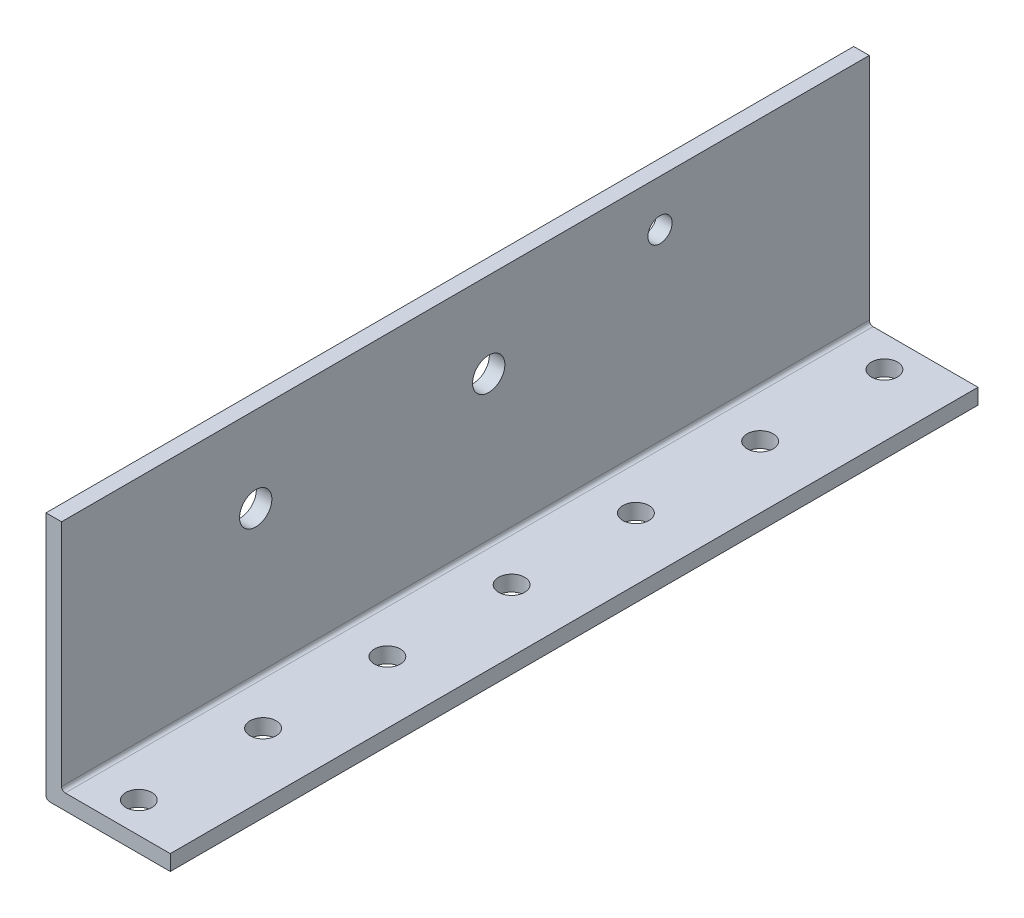
ISO-10303-21;
HEADER;
FILE_DESCRIPTION(('STEP AP214'),'2;1');
FILE_NAME('part.step','',(''),(''),'','','');
FILE_SCHEMA(('AUTOMOTIVE_DESIGN { 1 0 10303 214 1 1 1 1 }'));
ENDSEC;
DATA;
#1=APPLICATION_CONTEXT('core data for automotive mechanical design processes');
#2=APPLICATION_PROTOCOL_DEFINITION('international standard','automotive_design',2000,#1);
#3=PRODUCT_CONTEXT('',#1,'mechanical');
#4=PRODUCT('Part','Part','',(#3));
#5=PRODUCT_RELATED_PRODUCT_CATEGORY('part','',(#4));
#6=PRODUCT_DEFINITION_FORMATION('','',#4);
#7=PRODUCT_DEFINITION_CONTEXT('part definition',#1,'design');
#8=PRODUCT_DEFINITION('design','',#6,#7);
#9=PRODUCT_DEFINITION_SHAPE('','',#8);
#10=(LENGTH_UNIT() NAMED_UNIT(*) SI_UNIT(.MILLI.,.METRE.));
#11=(NAMED_UNIT(*) PLANE_ANGLE_UNIT() SI_UNIT($,.RADIAN.));
#12=(NAMED_UNIT(*) SI_UNIT($,.STERADIAN.) SOLID_ANGLE_UNIT());
#13=UNCERTAINTY_MEASURE_WITH_UNIT(LENGTH_MEASURE(1.E-05),#10,'distance_accuracy_value','');
#14=(GEOMETRIC_REPRESENTATION_CONTEXT(3) GLOBAL_UNCERTAINTY_ASSIGNED_CONTEXT((#13)) GLOBAL_UNIT_ASSIGNED_CONTEXT((#10,
#11,#12)) REPRESENTATION_CONTEXT('',''));
#15=CARTESIAN_POINT('',(0.,0.,0.));
#16=DIRECTION('',(0.,0.,1.));
#17=DIRECTION('',(1.,0.,0.));
#18=AXIS2_PLACEMENT_3D('',#15,#16,#17);
#19=CARTESIAN_POINT('',(0.,50.8,165.1));
#20=DIRECTION('',(0.,-1.,0.));
#21=DIRECTION('',(0.,0.,-1.));
#22=AXIS2_PLACEMENT_3D('',#19,#20,#21);
#23=PLANE('',#22);
#24=DIRECTION('',(-1.,0.,0.));
#25=VECTOR('',#24,1.);
#26=CARTESIAN_POINT('',(0.,50.8,0.));
#27=LINE('',#26,#25);
#28=CARTESIAN_POINT('',(3.17499999999999,50.8,0.));
#29=VERTEX_POINT('',#28);
#30=CARTESIAN_POINT('',(0.,50.8,0.));
#31=VERTEX_POINT('',#30);
#32=EDGE_CURVE('E130',#29,#31,#27,.T.);
#33=ORIENTED_EDGE('',*,*,#32,.T.);
#34=DIRECTION('',(0.,0.,-1.));
#35=VECTOR('',#34,1.);
#36=CARTESIAN_POINT('',(0.,50.8,165.1));
#37=LINE('',#36,#35);
#38=CARTESIAN_POINT('',(0.,50.8,165.1));
#39=VERTEX_POINT('',#38);
#40=EDGE_CURVE('E11',#39,#31,#37,.T.);
#41=ORIENTED_EDGE('',*,*,#40,.F.);
#42=DIRECTION('',(-1.,0.,0.));
#43=VECTOR('',#42,1.);
#44=CARTESIAN_POINT('',(0.,50.8,165.1));
#45=LINE('',#44,#43);
#46=CARTESIAN_POINT('',(3.17499999999999,50.8,165.1));
#47=VERTEX_POINT('',#46);
#48=EDGE_CURVE('E145',#47,#39,#45,.T.);
#49=ORIENTED_EDGE('',*,*,#48,.F.);
#50=DIRECTION('',(0.,0.,-1.));
#51=VECTOR('',#50,1.);
#52=CARTESIAN_POINT('',(3.17499999999999,50.8,165.1));
#53=LINE('',#52,#51);
#54=EDGE_CURVE('E126',#47,#29,#53,.T.);
#55=ORIENTED_EDGE('',*,*,#54,.T.);
#56=EDGE_LOOP('',(#33,#41,#49,#55));
#57=FACE_BOUND('',#56,.T.);
#58=ADVANCED_FACE('F33',(#57),#23,.F.);
#59=CARTESIAN_POINT('',(0.,0.762000000000005,165.1));
#60=DIRECTION('',(1.,0.,0.));
#61=DIRECTION('',(0.,0.,-1.));
#62=AXIS2_PLACEMENT_3D('',#59,#60,#61);
#63=PLANE('',#62);
#64=CARTESIAN_POINT('',(0.,41.347136,42.773092));
#65=DIRECTION('',(1.,0.,0.));
#66=DIRECTION('',(0.,0.,-1.));
#67=AXIS2_PLACEMENT_3D('',#64,#65,#66);
#68=CIRCLE('',#67,2.4765);
#69=CARTESIAN_POINT('',(0.,43.823636,42.773092));
#70=VERTEX_POINT('',#69);
#71=EDGE_CURVE('E232',#70,#70,#68,.F.);
#72=ORIENTED_EDGE('',*,*,#71,.F.);
#73=EDGE_LOOP('',(#72));
#74=FACE_BOUND('',#73,.T.);
#75=CARTESIAN_POINT('',(0.,33.3375,125.4125));
#76=DIRECTION('',(1.,0.,0.));
#77=DIRECTION('',(0.,0.,-1.));
#78=AXIS2_PLACEMENT_3D('',#75,#76,#77);
#79=CIRCLE('',#78,3.30199999999998);
#80=CARTESIAN_POINT('',(0.,33.3375,122.1105));
#81=VERTEX_POINT('',#80);
#82=EDGE_CURVE('E226',#81,#81,#79,.F.);
#83=ORIENTED_EDGE('',*,*,#82,.F.);
#84=EDGE_LOOP('',(#83));
#85=FACE_BOUND('',#84,.T.);
#86=CARTESIAN_POINT('',(0.,33.3375,77.7875));
#87=DIRECTION('',(1.,0.,0.));
#88=DIRECTION('',(0.,0.,-1.));
#89=AXIS2_PLACEMENT_3D('',#86,#87,#88);
#90=CIRCLE('',#89,3.30199999999998);
#91=CARTESIAN_POINT('',(0.,33.3375,74.4855));
#92=VERTEX_POINT('',#91);
#93=EDGE_CURVE('E192',#92,#92,#90,.F.);
#94=ORIENTED_EDGE('',*,*,#93,.F.);
#95=EDGE_LOOP('',(#94));
#96=FACE_BOUND('',#95,.T.);
#97=DIRECTION('',(0.,-1.,0.));
#98=VECTOR('',#97,1.);
#99=CARTESIAN_POINT('',(0.,0.762000000000005,0.));
#100=LINE('',#99,#98);
#101=CARTESIAN_POINT('',(0.,0.762000000000005,0.));
#102=VERTEX_POINT('',#101);
#103=EDGE_CURVE('E133',#31,#102,#100,.T.);
#104=ORIENTED_EDGE('',*,*,#103,.T.);
#105=DIRECTION('',(0.,0.,-1.));
#106=VECTOR('',#105,1.);
#107=CARTESIAN_POINT('',(0.,0.762000000000005,165.1));
#108=LINE('',#107,#106);
#109=CARTESIAN_POINT('',(0.,0.762000000000005,165.1));
#110=VERTEX_POINT('',#109);
#111=EDGE_CURVE('E42',#110,#102,#108,.T.);
#112=ORIENTED_EDGE('',*,*,#111,.F.);
#113=DIRECTION('',(0.,-1.,0.));
#114=VECTOR('',#113,1.);
#115=CARTESIAN_POINT('',(0.,0.762000000000005,165.1));
#116=LINE('',#115,#114);
#117=EDGE_CURVE('E93',#39,#110,#116,.T.);
#118=ORIENTED_EDGE('',*,*,#117,.F.);
#119=ORIENTED_EDGE('',*,*,#40,.T.);
#120=EDGE_LOOP('',(#104,#112,#118,#119));
#121=FACE_BOUND('',#120,.T.);
#122=ADVANCED_FACE('F253',(#74,#85,#96,#121),#63,.F.);
#123=CARTESIAN_POINT('',(0.762,0.762,165.1));
#124=DIRECTION('',(0.,0.,-1.));
#125=DIRECTION('',(-1.,0.,0.));
#126=AXIS2_PLACEMENT_3D('',#123,#124,#125);
#127=CYLINDRICAL_SURFACE('',#126,0.762);
#128=CARTESIAN_POINT('',(0.762,0.762,0.));
#129=DIRECTION('',(0.,0.,1.));
#130=DIRECTION('',(1.,0.,0.));
#131=AXIS2_PLACEMENT_3D('',#128,#129,#130);
#132=CIRCLE('',#131,0.762);
#133=CARTESIAN_POINT('',(0.762000000000005,0.,0.));
#134=VERTEX_POINT('',#133);
#135=EDGE_CURVE('E136',#102,#134,#132,.T.);
#136=ORIENTED_EDGE('',*,*,#135,.T.);
#137=DIRECTION('',(0.,0.,-1.));
#138=VECTOR('',#137,1.);
#139=CARTESIAN_POINT('',(0.762000000000005,0.,165.1));
#140=LINE('',#139,#138);
#141=CARTESIAN_POINT('',(0.762000000000005,0.,165.1));
#142=VERTEX_POINT('',#141);
#143=EDGE_CURVE('E152',#142,#134,#140,.T.);
#144=ORIENTED_EDGE('',*,*,#143,.F.);
#145=CARTESIAN_POINT('',(0.762,0.762,165.1));
#146=DIRECTION('',(0.,0.,1.));
#147=DIRECTION('',(1.,0.,0.));
#148=AXIS2_PLACEMENT_3D('',#145,#146,#147);
#149=CIRCLE('',#148,0.762);
#150=EDGE_CURVE('E161',#110,#142,#149,.T.);
#151=ORIENTED_EDGE('',*,*,#150,.F.);
#152=ORIENTED_EDGE('',*,*,#111,.T.);
#153=EDGE_LOOP('',(#136,#144,#151,#152));
#154=FACE_BOUND('',#153,.T.);
#155=ADVANCED_FACE('F159',(#154),#127,.T.);
#156=CARTESIAN_POINT('',(0.762000000000005,0.,165.1));
#157=DIRECTION('',(0.,1.,0.));
#158=DIRECTION('',(0.,0.,1.));
#159=AXIS2_PLACEMENT_3D('',#156,#157,#158);
#160=PLANE('',#159);
#161=CARTESIAN_POINT('',(12.6999999999999,0.,31.82874));
#162=DIRECTION('',(0.,-1.,0.));
#163=DIRECTION('',(0.,0.,-1.));
#164=AXIS2_PLACEMENT_3D('',#161,#162,#163);
#165=CIRCLE('',#164,2.667);
#166=CARTESIAN_POINT('',(12.6999999999999,0.,29.16174));
#167=VERTEX_POINT('',#166);
#168=EDGE_CURVE('E214',#167,#167,#165,.T.);
#169=ORIENTED_EDGE('',*,*,#168,.F.);
#170=EDGE_LOOP('',(#169));
#171=FACE_BOUND('',#170,.T.);
#172=CARTESIAN_POINT('',(12.6999999999998,0.,57.22874));
#173=DIRECTION('',(0.,-1.,0.));
#174=DIRECTION('',(0.,0.,-1.));
#175=AXIS2_PLACEMENT_3D('',#172,#173,#174);
#176=CIRCLE('',#175,2.667);
#177=CARTESIAN_POINT('',(12.6999999999998,0.,54.56174));
#178=VERTEX_POINT('',#177);
#179=EDGE_CURVE('E208',#178,#178,#176,.T.);
#180=ORIENTED_EDGE('',*,*,#179,.F.);
#181=EDGE_LOOP('',(#180));
#182=FACE_BOUND('',#181,.T.);
#183=CARTESIAN_POINT('',(12.6999999999997,0.,82.62874));
#184=DIRECTION('',(0.,-1.,0.));
#185=DIRECTION('',(0.,0.,-1.));
#186=AXIS2_PLACEMENT_3D('',#183,#184,#185);
#187=CIRCLE('',#186,2.667);
#188=CARTESIAN_POINT('',(12.6999999999997,0.,79.96174));
#189=VERTEX_POINT('',#188);
#190=EDGE_CURVE('E202',#189,#189,#187,.T.);
#191=ORIENTED_EDGE('',*,*,#190,.F.);
#192=EDGE_LOOP('',(#191));
#193=FACE_BOUND('',#192,.T.);
#194=CARTESIAN_POINT('',(12.6999999999996,0.,108.02874));
#195=DIRECTION('',(0.,-1.,0.));
#196=DIRECTION('',(0.,0.,-1.));
#197=AXIS2_PLACEMENT_3D('',#194,#195,#196);
#198=CIRCLE('',#197,2.667);
#199=CARTESIAN_POINT('',(12.6999999999996,0.,105.36174));
#200=VERTEX_POINT('',#199);
#201=EDGE_CURVE('E196',#200,#200,#198,.T.);
#202=ORIENTED_EDGE('',*,*,#201,.F.);
#203=EDGE_LOOP('',(#202));
#204=FACE_BOUND('',#203,.T.);
#205=CARTESIAN_POINT('',(12.6999999999996,0.,133.42874));
#206=DIRECTION('',(0.,-1.,0.));
#207=DIRECTION('',(0.,0.,-1.));
#208=AXIS2_PLACEMENT_3D('',#205,#206,#207);
#209=CIRCLE('',#208,2.667);
#210=CARTESIAN_POINT('',(12.6999999999996,0.,130.76174));
#211=VERTEX_POINT('',#210);
#212=EDGE_CURVE('E188',#211,#211,#209,.T.);
#213=ORIENTED_EDGE('',*,*,#212,.F.);
#214=EDGE_LOOP('',(#213));
#215=FACE_BOUND('',#214,.T.);
#216=CARTESIAN_POINT('',(12.6999999999995,0.,158.82874));
#217=DIRECTION('',(0.,-1.,0.));
#218=DIRECTION('',(0.,0.,-1.));
#219=AXIS2_PLACEMENT_3D('',#216,#217,#218);
#220=CIRCLE('',#219,2.667);
#221=CARTESIAN_POINT('',(12.6999999999995,0.,156.16174));
#222=VERTEX_POINT('',#221);
#223=EDGE_CURVE('E189',#222,#222,#220,.T.);
#224=ORIENTED_EDGE('',*,*,#223,.F.);
#225=EDGE_LOOP('',(#224));
#226=FACE_BOUND('',#225,.T.);
#227=CARTESIAN_POINT('',(12.7,0.,6.42873999999999));
#228=DIRECTION('',(0.,-1.,0.));
#229=DIRECTION('',(0.,0.,-1.));
#230=AXIS2_PLACEMENT_3D('',#227,#228,#229);
#231=CIRCLE('',#230,2.667);
#232=CARTESIAN_POINT('',(12.7,0.,3.76173999999999));
#233=VERTEX_POINT('',#232);
#234=EDGE_CURVE('E181',#233,#233,#231,.T.);
#235=ORIENTED_EDGE('',*,*,#234,.F.);
#236=EDGE_LOOP('',(#235));
#237=FACE_BOUND('',#236,.T.);
#238=DIRECTION('',(1.,0.,0.));
#239=VECTOR('',#238,1.);
#240=CARTESIAN_POINT('',(0.762000000000005,0.,0.));
#241=LINE('',#240,#239);
#242=CARTESIAN_POINT('',(25.4,0.,0.));
#243=VERTEX_POINT('',#242);
#244=EDGE_CURVE('E138',#134,#243,#241,.T.);
#245=ORIENTED_EDGE('',*,*,#244,.T.);
#246=DIRECTION('',(0.,0.,-1.));
#247=VECTOR('',#246,1.);
#248=CARTESIAN_POINT('',(25.4,0.,165.1));
#249=LINE('',#248,#247);
#250=CARTESIAN_POINT('',(25.4,0.,165.1));
#251=VERTEX_POINT('',#250);
#252=EDGE_CURVE('E149',#251,#243,#249,.T.);
#253=ORIENTED_EDGE('',*,*,#252,.F.);
#254=DIRECTION('',(1.,0.,0.));
#255=VECTOR('',#254,1.);
#256=CARTESIAN_POINT('',(0.762000000000005,0.,165.1));
#257=LINE('',#256,#255);
#258=EDGE_CURVE('E173',#142,#251,#257,.T.);
#259=ORIENTED_EDGE('',*,*,#258,.F.);
#260=ORIENTED_EDGE('',*,*,#143,.T.);
#261=EDGE_LOOP('',(#245,#253,#259,#260));
#262=FACE_BOUND('',#261,.T.);
#263=ADVANCED_FACE('F169',(#171,#182,#193,#204,#215,#226,#237,#262),#160,.F.);
#264=CARTESIAN_POINT('',(25.4,0.,165.1));
#265=DIRECTION('',(-1.,0.,0.));
#266=DIRECTION('',(0.,0.,1.));
#267=AXIS2_PLACEMENT_3D('',#264,#265,#266);
#268=PLANE('',#267);
#269=DIRECTION('',(0.,1.,0.));
#270=VECTOR('',#269,1.);
#271=CARTESIAN_POINT('',(25.4,0.,0.));
#272=LINE('',#271,#270);
#273=CARTESIAN_POINT('',(25.4,3.175,0.));
#274=VERTEX_POINT('',#273);
#275=EDGE_CURVE('E140',#243,#274,#272,.T.);
#276=ORIENTED_EDGE('',*,*,#275,.T.);
#277=DIRECTION('',(0.,0.,-1.));
#278=VECTOR('',#277,1.);
#279=CARTESIAN_POINT('',(25.4,3.175,165.1));
#280=LINE('',#279,#278);
#281=CARTESIAN_POINT('',(25.4,3.175,165.1));
#282=VERTEX_POINT('',#281);
#283=EDGE_CURVE('E121',#282,#274,#280,.T.);
#284=ORIENTED_EDGE('',*,*,#283,.F.);
#285=DIRECTION('',(0.,1.,0.));
#286=VECTOR('',#285,1.);
#287=CARTESIAN_POINT('',(25.4,0.,165.1));
#288=LINE('',#287,#286);
#289=EDGE_CURVE('E112',#251,#282,#288,.T.);
#290=ORIENTED_EDGE('',*,*,#289,.F.);
#291=ORIENTED_EDGE('',*,*,#252,.T.);
#292=EDGE_LOOP('',(#276,#284,#290,#291));
#293=FACE_BOUND('',#292,.T.);
#294=ADVANCED_FACE('F172',(#293),#268,.F.);
#295=CARTESIAN_POINT('',(3.93699999999999,3.175,165.1));
#296=DIRECTION('',(0.,-1.,0.));
#297=DIRECTION('',(0.,0.,-1.));
#298=AXIS2_PLACEMENT_3D('',#295,#296,#297);
#299=PLANE('',#298);
#300=CARTESIAN_POINT('',(12.6999999999999,3.175,31.82874));
#301=DIRECTION('',(0.,-1.,0.));
#302=DIRECTION('',(0.,0.,-1.));
#303=AXIS2_PLACEMENT_3D('',#300,#301,#302);
#304=CIRCLE('',#303,2.667);
#305=CARTESIAN_POINT('',(12.6999999999999,3.175,29.16174));
#306=VERTEX_POINT('',#305);
#307=EDGE_CURVE('E184',#306,#306,#304,.F.);
#308=ORIENTED_EDGE('',*,*,#307,.F.);
#309=EDGE_LOOP('',(#308));
#310=FACE_BOUND('',#309,.T.);
#311=CARTESIAN_POINT('',(12.6999999999998,3.175,57.22874));
#312=DIRECTION('',(0.,-1.,0.));
#313=DIRECTION('',(0.,0.,-1.));
#314=AXIS2_PLACEMENT_3D('',#311,#312,#313);
#315=CIRCLE('',#314,2.667);
#316=CARTESIAN_POINT('',(12.6999999999998,3.175,54.56174));
#317=VERTEX_POINT('',#316);
#318=EDGE_CURVE('E211',#317,#317,#315,.F.);
#319=ORIENTED_EDGE('',*,*,#318,.F.);
#320=EDGE_LOOP('',(#319));
#321=FACE_BOUND('',#320,.T.);
#322=CARTESIAN_POINT('',(12.6999999999997,3.175,82.62874));
#323=DIRECTION('',(0.,-1.,0.));
#324=DIRECTION('',(0.,0.,-1.));
#325=AXIS2_PLACEMENT_3D('',#322,#323,#324);
#326=CIRCLE('',#325,2.667);
#327=CARTESIAN_POINT('',(12.6999999999997,3.175,79.96174));
#328=VERTEX_POINT('',#327);
#329=EDGE_CURVE('E205',#328,#328,#326,.F.);
#330=ORIENTED_EDGE('',*,*,#329,.F.);
#331=EDGE_LOOP('',(#330));
#332=FACE_BOUND('',#331,.T.);
#333=CARTESIAN_POINT('',(12.6999999999996,3.175,108.02874));
#334=DIRECTION('',(0.,-1.,0.));
#335=DIRECTION('',(0.,0.,-1.));
#336=AXIS2_PLACEMENT_3D('',#333,#334,#335);
#337=CIRCLE('',#336,2.667);
#338=CARTESIAN_POINT('',(12.6999999999996,3.175,105.36174));
#339=VERTEX_POINT('',#338);
#340=EDGE_CURVE('E199',#339,#339,#337,.F.);
#341=ORIENTED_EDGE('',*,*,#340,.F.);
#342=EDGE_LOOP('',(#341));
#343=FACE_BOUND('',#342,.T.);
#344=CARTESIAN_POINT('',(12.6999999999996,3.175,133.42874));
#345=DIRECTION('',(0.,-1.,0.));
#346=DIRECTION('',(0.,0.,-1.));
#347=AXIS2_PLACEMENT_3D('',#344,#345,#346);
#348=CIRCLE('',#347,2.667);
#349=CARTESIAN_POINT('',(12.6999999999996,3.175,130.76174));
#350=VERTEX_POINT('',#349);
#351=EDGE_CURVE('E193',#350,#350,#348,.F.);
#352=ORIENTED_EDGE('',*,*,#351,.F.);
#353=EDGE_LOOP('',(#352));
#354=FACE_BOUND('',#353,.T.);
#355=CARTESIAN_POINT('',(12.6999999999995,3.175,158.82874));
#356=DIRECTION('',(0.,-1.,0.));
#357=DIRECTION('',(0.,0.,-1.));
#358=AXIS2_PLACEMENT_3D('',#355,#356,#357);
#359=CIRCLE('',#358,2.667);
#360=CARTESIAN_POINT('',(12.6999999999995,3.175,156.16174));
#361=VERTEX_POINT('',#360);
#362=EDGE_CURVE('E185',#361,#361,#359,.F.);
#363=ORIENTED_EDGE('',*,*,#362,.F.);
#364=EDGE_LOOP('',(#363));
#365=FACE_BOUND('',#364,.T.);
#366=CARTESIAN_POINT('',(12.7,3.175,6.42873999999999));
#367=DIRECTION('',(0.,-1.,0.));
#368=DIRECTION('',(0.,0.,-1.));
#369=AXIS2_PLACEMENT_3D('',#366,#367,#368);
#370=CIRCLE('',#369,2.667);
#371=CARTESIAN_POINT('',(12.7,3.175,3.76173999999999));
#372=VERTEX_POINT('',#371);
#373=EDGE_CURVE('E134',#372,#372,#370,.F.);
#374=ORIENTED_EDGE('',*,*,#373,.F.);
#375=EDGE_LOOP('',(#374));
#376=FACE_BOUND('',#375,.T.);
#377=DIRECTION('',(-1.,0.,0.));
#378=VECTOR('',#377,1.);
#379=CARTESIAN_POINT('',(3.93699999999999,3.175,0.));
#380=LINE('',#379,#378);
#381=CARTESIAN_POINT('',(3.93699999999999,3.175,0.));
#382=VERTEX_POINT('',#381);
#383=EDGE_CURVE('E120',#274,#382,#380,.T.);
#384=ORIENTED_EDGE('',*,*,#383,.T.);
#385=DIRECTION('',(0.,0.,-1.));
#386=VECTOR('',#385,1.);
#387=CARTESIAN_POINT('',(3.93699999999999,3.175,165.1));
#388=LINE('',#387,#386);
#389=CARTESIAN_POINT('',(3.93699999999999,3.175,165.1));
#390=VERTEX_POINT('',#389);
#391=EDGE_CURVE('E117',#390,#382,#388,.T.);
#392=ORIENTED_EDGE('',*,*,#391,.F.);
#393=DIRECTION('',(-1.,0.,0.));
#394=VECTOR('',#393,1.);
#395=CARTESIAN_POINT('',(3.93699999999999,3.175,165.1));
#396=LINE('',#395,#394);
#397=EDGE_CURVE('E106',#282,#390,#396,.T.);
#398=ORIENTED_EDGE('',*,*,#397,.F.);
#399=ORIENTED_EDGE('',*,*,#283,.T.);
#400=EDGE_LOOP('',(#384,#392,#398,#399));
#401=FACE_BOUND('',#400,.T.);
#402=ADVANCED_FACE('F118',(#310,#321,#332,#343,#354,#365,#376,#401),#299,.F.);
#403=CARTESIAN_POINT('',(3.93699999999999,3.937,165.1));
#404=DIRECTION('',(0.,0.,-1.));
#405=DIRECTION('',(-1.,0.,0.));
#406=AXIS2_PLACEMENT_3D('',#403,#404,#405);
#407=CYLINDRICAL_SURFACE('',#406,0.762);
#408=CARTESIAN_POINT('',(3.93699999999999,3.937,0.));
#409=DIRECTION('',(0.,0.,-1.));
#410=DIRECTION('',(1.,0.,0.));
#411=AXIS2_PLACEMENT_3D('',#408,#409,#410);
#412=CIRCLE('',#411,0.762);
#413=CARTESIAN_POINT('',(3.17499999999999,3.937,0.));
#414=VERTEX_POINT('',#413);
#415=EDGE_CURVE('E79',#382,#414,#412,.T.);
#416=ORIENTED_EDGE('',*,*,#415,.T.);
#417=DIRECTION('',(0.,0.,-1.));
#418=VECTOR('',#417,1.);
#419=CARTESIAN_POINT('',(3.17499999999999,3.937,165.1));
#420=LINE('',#419,#418);
#421=CARTESIAN_POINT('',(3.17499999999999,3.937,165.1));
#422=VERTEX_POINT('',#421);
#423=EDGE_CURVE('E122',#422,#414,#420,.T.);
#424=ORIENTED_EDGE('',*,*,#423,.F.);
#425=CARTESIAN_POINT('',(3.93699999999999,3.937,165.1));
#426=DIRECTION('',(0.,0.,-1.));
#427=DIRECTION('',(1.,0.,0.));
#428=AXIS2_PLACEMENT_3D('',#425,#426,#427);
#429=CIRCLE('',#428,0.762);
#430=EDGE_CURVE('E110',#390,#422,#429,.T.);
#431=ORIENTED_EDGE('',*,*,#430,.F.);
#432=ORIENTED_EDGE('',*,*,#391,.T.);
#433=EDGE_LOOP('',(#416,#424,#431,#432));
#434=FACE_BOUND('',#433,.T.);
#435=ADVANCED_FACE('F124',(#434),#407,.F.);
#436=CARTESIAN_POINT('',(3.17499999999999,50.8,165.1));
#437=DIRECTION('',(-1.,0.,0.));
#438=DIRECTION('',(0.,-1.,0.));
#439=AXIS2_PLACEMENT_3D('',#436,#437,#438);
#440=PLANE('',#439);
#441=CARTESIAN_POINT('',(3.17499999999999,41.347136,42.773092));
#442=DIRECTION('',(-1.,0.,0.));
#443=DIRECTION('',(0.,-1.,0.));
#444=AXIS2_PLACEMENT_3D('',#441,#442,#443);
#445=CIRCLE('',#444,2.4765);
#446=CARTESIAN_POINT('',(3.17499999999999,43.823636,42.773092));
#447=VERTEX_POINT('',#446);
#448=EDGE_CURVE('E36',#447,#447,#445,.T.);
#449=ORIENTED_EDGE('',*,*,#448,.T.);
#450=EDGE_LOOP('',(#449));
#451=FACE_BOUND('',#450,.T.);
#452=CARTESIAN_POINT('',(3.17499999999999,33.3375,125.4125));
#453=DIRECTION('',(1.,0.,0.));
#454=DIRECTION('',(0.,1.,0.));
#455=AXIS2_PLACEMENT_3D('',#452,#453,#454);
#456=CIRCLE('',#455,3.30199999999998);
#457=CARTESIAN_POINT('',(3.17499999999999,36.6395,125.4125));
#458=VERTEX_POINT('',#457);
#459=EDGE_CURVE('E229',#458,#458,#456,.T.);
#460=ORIENTED_EDGE('',*,*,#459,.F.);
#461=EDGE_LOOP('',(#460));
#462=FACE_BOUND('',#461,.T.);
#463=CARTESIAN_POINT('',(3.17499999999999,33.3375,77.7875));
#464=DIRECTION('',(1.,0.,0.));
#465=DIRECTION('',(0.,1.,0.));
#466=AXIS2_PLACEMENT_3D('',#463,#464,#465);
#467=CIRCLE('',#466,3.30199999999998);
#468=CARTESIAN_POINT('',(3.17499999999999,36.6395,77.7875));
#469=VERTEX_POINT('',#468);
#470=EDGE_CURVE('E223',#469,#469,#467,.T.);
#471=ORIENTED_EDGE('',*,*,#470,.F.);
#472=EDGE_LOOP('',(#471));
#473=FACE_BOUND('',#472,.T.);
#474=DIRECTION('',(0.,1.,0.));
#475=VECTOR('',#474,1.);
#476=CARTESIAN_POINT('',(3.17499999999999,50.8,0.));
#477=LINE('',#476,#475);
#478=EDGE_CURVE('E85',#414,#29,#477,.T.);
#479=ORIENTED_EDGE('',*,*,#478,.T.);
#480=ORIENTED_EDGE('',*,*,#54,.F.);
#481=DIRECTION('',(0.,1.,0.));
#482=VECTOR('',#481,1.);
#483=CARTESIAN_POINT('',(3.17499999999999,50.8,165.1));
#484=LINE('',#483,#482);
#485=EDGE_CURVE('E50',#422,#47,#484,.T.);
#486=ORIENTED_EDGE('',*,*,#485,.F.);
#487=ORIENTED_EDGE('',*,*,#423,.T.);
#488=EDGE_LOOP('',(#479,#480,#486,#487));
#489=FACE_BOUND('',#488,.T.);
#490=ADVANCED_FACE('F239',(#451,#462,#473,#489),#440,.F.);
#491=CARTESIAN_POINT('',(3.93699999999999,3.937,165.1));
#492=DIRECTION('',(0.,0.,1.));
#493=DIRECTION('',(1.,0.,0.));
#494=AXIS2_PLACEMENT_3D('',#491,#492,#493);
#495=PLANE('',#494);
#496=ORIENTED_EDGE('',*,*,#48,.T.);
#497=ORIENTED_EDGE('',*,*,#117,.T.);
#498=ORIENTED_EDGE('',*,*,#150,.T.);
#499=ORIENTED_EDGE('',*,*,#258,.T.);
#500=ORIENTED_EDGE('',*,*,#289,.T.);
#501=ORIENTED_EDGE('',*,*,#397,.T.);
#502=ORIENTED_EDGE('',*,*,#430,.T.);
#503=ORIENTED_EDGE('',*,*,#485,.T.);
#504=EDGE_LOOP('',(#496,#497,#498,#499,#500,#501,#502,#503));
#505=FACE_BOUND('',#504,.T.);
#506=ADVANCED_FACE('F108',(#505),#495,.T.);
#507=CARTESIAN_POINT('',(3.93699999999999,3.937,0.));
#508=DIRECTION('',(0.,0.,1.));
#509=DIRECTION('',(1.,0.,0.));
#510=AXIS2_PLACEMENT_3D('',#507,#508,#509);
#511=PLANE('',#510);
#512=ORIENTED_EDGE('',*,*,#32,.F.);
#513=ORIENTED_EDGE('',*,*,#478,.F.);
#514=ORIENTED_EDGE('',*,*,#415,.F.);
#515=ORIENTED_EDGE('',*,*,#383,.F.);
#516=ORIENTED_EDGE('',*,*,#275,.F.);
#517=ORIENTED_EDGE('',*,*,#244,.F.);
#518=ORIENTED_EDGE('',*,*,#135,.F.);
#519=ORIENTED_EDGE('',*,*,#103,.F.);
#520=EDGE_LOOP('',(#512,#513,#514,#515,#516,#517,#518,#519));
#521=FACE_BOUND('',#520,.T.);
#522=ADVANCED_FACE('F165',(#521),#511,.F.);
#523=CARTESIAN_POINT('',(12.7,10.7184151416981,6.42873999999999));
#524=DIRECTION('',(0.,-1.,0.));
#525=DIRECTION('',(0.,0.,-1.));
#526=AXIS2_PLACEMENT_3D('',#523,#524,#525);
#527=CYLINDRICAL_SURFACE('',#526,2.667);
#528=ORIENTED_EDGE('',*,*,#373,.T.);
#529=EDGE_LOOP('',(#528));
#530=FACE_BOUND('',#529,.T.);
#531=ORIENTED_EDGE('',*,*,#234,.T.);
#532=EDGE_LOOP('',(#531));
#533=FACE_BOUND('',#532,.T.);
#534=ADVANCED_FACE('F316',(#530,#533),#527,.F.);
#535=CARTESIAN_POINT('',(12.6999999999995,10.7184151416981,158.82874));
#536=DIRECTION('',(0.,-1.,0.));
#537=DIRECTION('',(0.,0.,-1.));
#538=AXIS2_PLACEMENT_3D('',#535,#536,#537);
#539=CYLINDRICAL_SURFACE('',#538,2.667);
#540=ORIENTED_EDGE('',*,*,#362,.T.);
#541=EDGE_LOOP('',(#540));
#542=FACE_BOUND('',#541,.T.);
#543=ORIENTED_EDGE('',*,*,#223,.T.);
#544=EDGE_LOOP('',(#543));
#545=FACE_BOUND('',#544,.T.);
#546=ADVANCED_FACE('F321',(#542,#545),#539,.F.);
#547=CARTESIAN_POINT('',(12.6999999999996,10.7184151416981,133.42874));
#548=DIRECTION('',(0.,-1.,0.));
#549=DIRECTION('',(0.,0.,-1.));
#550=AXIS2_PLACEMENT_3D('',#547,#548,#549);
#551=CYLINDRICAL_SURFACE('',#550,2.667);
#552=ORIENTED_EDGE('',*,*,#351,.T.);
#553=EDGE_LOOP('',(#552));
#554=FACE_BOUND('',#553,.T.);
#555=ORIENTED_EDGE('',*,*,#212,.T.);
#556=EDGE_LOOP('',(#555));
#557=FACE_BOUND('',#556,.T.);
#558=ADVANCED_FACE('F329',(#554,#557),#551,.F.);
#559=CARTESIAN_POINT('',(12.6999999999996,10.7184151416981,108.02874));
#560=DIRECTION('',(0.,-1.,0.));
#561=DIRECTION('',(0.,0.,-1.));
#562=AXIS2_PLACEMENT_3D('',#559,#560,#561);
#563=CYLINDRICAL_SURFACE('',#562,2.667);
#564=ORIENTED_EDGE('',*,*,#340,.T.);
#565=EDGE_LOOP('',(#564));
#566=FACE_BOUND('',#565,.T.);
#567=ORIENTED_EDGE('',*,*,#201,.T.);
#568=EDGE_LOOP('',(#567));
#569=FACE_BOUND('',#568,.T.);
#570=ADVANCED_FACE('F337',(#566,#569),#563,.F.);
#571=CARTESIAN_POINT('',(12.6999999999997,10.7184151416981,82.62874));
#572=DIRECTION('',(0.,-1.,0.));
#573=DIRECTION('',(0.,0.,-1.));
#574=AXIS2_PLACEMENT_3D('',#571,#572,#573);
#575=CYLINDRICAL_SURFACE('',#574,2.667);
#576=ORIENTED_EDGE('',*,*,#329,.T.);
#577=EDGE_LOOP('',(#576));
#578=FACE_BOUND('',#577,.T.);
#579=ORIENTED_EDGE('',*,*,#190,.T.);
#580=EDGE_LOOP('',(#579));
#581=FACE_BOUND('',#580,.T.);
#582=ADVANCED_FACE('F345',(#578,#581),#575,.F.);
#583=CARTESIAN_POINT('',(12.6999999999998,10.7184151416981,57.22874));
#584=DIRECTION('',(0.,-1.,0.));
#585=DIRECTION('',(0.,0.,-1.));
#586=AXIS2_PLACEMENT_3D('',#583,#584,#585);
#587=CYLINDRICAL_SURFACE('',#586,2.667);
#588=ORIENTED_EDGE('',*,*,#318,.T.);
#589=EDGE_LOOP('',(#588));
#590=FACE_BOUND('',#589,.T.);
#591=ORIENTED_EDGE('',*,*,#179,.T.);
#592=EDGE_LOOP('',(#591));
#593=FACE_BOUND('',#592,.T.);
#594=ADVANCED_FACE('F353',(#590,#593),#587,.F.);
#595=CARTESIAN_POINT('',(12.6999999999999,10.7184151416981,31.82874));
#596=DIRECTION('',(0.,-1.,0.));
#597=DIRECTION('',(0.,0.,-1.));
#598=AXIS2_PLACEMENT_3D('',#595,#596,#597);
#599=CYLINDRICAL_SURFACE('',#598,2.667);
#600=ORIENTED_EDGE('',*,*,#307,.T.);
#601=EDGE_LOOP('',(#600));
#602=FACE_BOUND('',#601,.T.);
#603=ORIENTED_EDGE('',*,*,#168,.T.);
#604=EDGE_LOOP('',(#603));
#605=FACE_BOUND('',#604,.T.);
#606=ADVANCED_FACE('F361',(#602,#605),#599,.F.);
#607=CARTESIAN_POINT('',(-9.33946636591188,33.3375,77.7875));
#608=DIRECTION('',(1.,0.,0.));
#609=DIRECTION('',(0.,1.,0.));
#610=AXIS2_PLACEMENT_3D('',#607,#608,#609);
#611=CYLINDRICAL_SURFACE('',#610,3.30199999999998);
#612=ORIENTED_EDGE('',*,*,#93,.T.);
#613=EDGE_LOOP('',(#612));
#614=FACE_BOUND('',#613,.T.);
#615=ORIENTED_EDGE('',*,*,#470,.T.);
#616=EDGE_LOOP('',(#615));
#617=FACE_BOUND('',#616,.T.);
#618=ADVANCED_FACE('F249',(#614,#617),#611,.F.);
#619=CARTESIAN_POINT('',(-9.33946636591188,33.3375,125.4125));
#620=DIRECTION('',(1.,0.,0.));
#621=DIRECTION('',(0.,1.,0.));
#622=AXIS2_PLACEMENT_3D('',#619,#620,#621);
#623=CYLINDRICAL_SURFACE('',#622,3.30199999999998);
#624=ORIENTED_EDGE('',*,*,#82,.T.);
#625=EDGE_LOOP('',(#624));
#626=FACE_BOUND('',#625,.T.);
#627=ORIENTED_EDGE('',*,*,#459,.T.);
#628=EDGE_LOOP('',(#627));
#629=FACE_BOUND('',#628,.T.);
#630=ADVANCED_FACE('F244',(#626,#629),#623,.F.);
#631=CARTESIAN_POINT('',(-7.00459977443393,41.347136,42.773092));
#632=DIRECTION('',(1.,0.,0.));
#633=DIRECTION('',(0.,1.,0.));
#634=AXIS2_PLACEMENT_3D('',#631,#632,#633);
#635=CYLINDRICAL_SURFACE('',#634,2.4765);
#636=CARTESIAN_POINT('',(0.,43.823636,42.773092));
#637=CARTESIAN_POINT('',(0.0330729166666656,43.823636,42.773092));
#638=CARTESIAN_POINT('',(0.0661458333333321,43.823636,42.773092));
#639=CARTESIAN_POINT('',(0.132291666666665,43.823636,42.773092));
#640=CARTESIAN_POINT('',(0.165364583333332,43.823636,42.773092));
#641=CARTESIAN_POINT('',(0.231510416666665,43.823636,42.773092));
#642=CARTESIAN_POINT('',(0.264583333333332,43.823636,42.773092));
#643=CARTESIAN_POINT('',(0.330729166666665,43.823636,42.773092));
#644=CARTESIAN_POINT('',(0.363802083333331,43.823636,42.773092));
#645=CARTESIAN_POINT('',(0.429947916666664,43.823636,42.773092));
#646=CARTESIAN_POINT('',(0.463020833333331,43.823636,42.773092));
#647=CARTESIAN_POINT('',(0.529166666666664,43.823636,42.773092));
#648=CARTESIAN_POINT('',(0.562239583333331,43.823636,42.773092));
#649=CARTESIAN_POINT('',(0.628385416666664,43.823636,42.773092));
#650=CARTESIAN_POINT('',(0.661458333333331,43.823636,42.773092));
#651=CARTESIAN_POINT('',(0.727604166666664,43.823636,42.773092));
#652=CARTESIAN_POINT('',(0.76067708333333,43.823636,42.773092));
#653=CARTESIAN_POINT('',(0.826822916666663,43.823636,42.773092));
#654=CARTESIAN_POINT('',(0.859895833333329,43.823636,42.773092));
#655=CARTESIAN_POINT('',(0.926041666666662,43.823636,42.773092));
#656=CARTESIAN_POINT('',(0.959114583333328,43.823636,42.773092));
#657=CARTESIAN_POINT('',(1.02526041666666,43.823636,42.773092));
#658=CARTESIAN_POINT('',(1.05833333333333,43.823636,42.773092));
#659=CARTESIAN_POINT('',(1.12447916666666,43.823636,42.773092));
#660=CARTESIAN_POINT('',(1.15755208333333,43.823636,42.773092));
#661=CARTESIAN_POINT('',(1.22369791666666,43.823636,42.773092));
#662=CARTESIAN_POINT('',(1.25677083333333,43.823636,42.773092));
#663=CARTESIAN_POINT('',(1.32291666666666,43.823636,42.773092));
#664=CARTESIAN_POINT('',(1.35598958333333,43.823636,42.773092));
#665=CARTESIAN_POINT('',(1.42213541666666,43.823636,42.773092));
#666=CARTESIAN_POINT('',(1.45520833333333,43.823636,42.773092));
#667=CARTESIAN_POINT('',(1.52135416666666,43.823636,42.773092));
#668=CARTESIAN_POINT('',(1.55442708333333,43.823636,42.773092));
#669=CARTESIAN_POINT('',(1.62057291666666,43.823636,42.773092));
#670=CARTESIAN_POINT('',(1.65364583333333,43.823636,42.773092));
#671=CARTESIAN_POINT('',(1.71979166666666,43.823636,42.773092));
#672=CARTESIAN_POINT('',(1.75286458333333,43.823636,42.773092));
#673=CARTESIAN_POINT('',(1.81901041666666,43.823636,42.773092));
#674=CARTESIAN_POINT('',(1.85208333333333,43.823636,42.773092));
#675=CARTESIAN_POINT('',(1.91822916666666,43.823636,42.773092));
#676=CARTESIAN_POINT('',(1.95130208333332,43.823636,42.773092));
#677=CARTESIAN_POINT('',(2.01744791666666,43.823636,42.773092));
#678=CARTESIAN_POINT('',(2.05052083333333,43.823636,42.773092));
#679=CARTESIAN_POINT('',(2.11666666666666,43.823636,42.773092));
#680=CARTESIAN_POINT('',(2.14973958333333,43.823636,42.773092));
#681=CARTESIAN_POINT('',(2.21588541666666,43.823636,42.773092));
#682=CARTESIAN_POINT('',(2.24895833333332,43.823636,42.773092));
#683=CARTESIAN_POINT('',(2.31510416666666,43.823636,42.773092));
#684=CARTESIAN_POINT('',(2.34817708333332,43.823636,42.773092));
#685=CARTESIAN_POINT('',(2.41432291666666,43.823636,42.773092));
#686=CARTESIAN_POINT('',(2.44739583333332,43.823636,42.773092));
#687=CARTESIAN_POINT('',(2.51354166666666,43.823636,42.773092));
#688=CARTESIAN_POINT('',(2.54661458333332,43.823636,42.773092));
#689=CARTESIAN_POINT('',(2.61276041666666,43.823636,42.773092));
#690=CARTESIAN_POINT('',(2.64583333333332,43.823636,42.773092));
#691=CARTESIAN_POINT('',(2.71197916666666,43.823636,42.773092));
#692=CARTESIAN_POINT('',(2.74505208333332,43.823636,42.773092));
#693=CARTESIAN_POINT('',(2.81119791666666,43.823636,42.773092));
#694=CARTESIAN_POINT('',(2.84427083333332,43.823636,42.773092));
#695=CARTESIAN_POINT('',(2.91041666666666,43.823636,42.773092));
#696=CARTESIAN_POINT('',(2.94348958333332,43.823636,42.773092));
#697=CARTESIAN_POINT('',(3.00963541666666,43.823636,42.773092));
#698=CARTESIAN_POINT('',(3.04270833333332,43.823636,42.773092));
#699=CARTESIAN_POINT('',(3.10885416666666,43.823636,42.773092));
#700=CARTESIAN_POINT('',(3.14192708333332,43.823636,42.773092));
#701=CARTESIAN_POINT('',(3.17499999999999,43.823636,42.773092));
#702=B_SPLINE_CURVE_WITH_KNOTS('',3,(#636,#637,#638,#639,#640,#641,#642,#643,#644,#645,#646,
#647,#648,#649,#650,#651,#652,#653,#654,#655,#656,#657,#658,#659,#660,#661,#662,#663,#664,#665,
#666,#667,#668,#669,#670,#671,#672,#673,#674,#675,#676,#677,#678,#679,#680,#681,#682,#683,#684,
#685,#686,#687,#688,#689,#690,#691,#692,#693,#694,#695,#696,#697,#698,#699,#700,#701),
.UNSPECIFIED.,.F.,.F.,(4,2,2,2,2,2,2,2,2,2,2,2,2,2,2,2,2,2,2,2,2,2,2,2,2,2,2,2,2,2,2,2,4),(0.,
0.0992187499999995,0.198437499999999,0.297656249999999,0.396874999999999,0.496093749999998,
0.595312499999999,0.694531249999998,0.793749999999998,0.892968749999996,0.992187499999996,
1.09140625,1.190625,1.28984375,1.3890625,1.48828124999999,1.58749999999999,1.68671874999999,
1.78593749999999,1.88515624999999,1.98437499999999,2.08359374999999,2.18281249999999,
2.28203124999999,2.38124999999999,2.48046874999999,2.57968749999999,2.67890624999999,
2.77812499999999,2.87734374999999,2.97656249999999,3.07578124999999,3.17499999999999),.UNSPECIFIED.);
#703=EDGE_CURVE('BSEAM242',#70,#447,#702,.T.);
#704=ORIENTED_EDGE('',*,*,#71,.T.);
#705=ORIENTED_EDGE('',*,*,#448,.F.);
#706=ORIENTED_EDGE('',*,*,#703,.T.);
#707=ORIENTED_EDGE('',*,*,#703,.F.);
#708=EDGE_LOOP('',(#704,#706,#705,#707));
#709=FACE_BOUND('',#708,.T.);
#710=ADVANCED_FACE('F242',(#709),#635,.F.);
#711=CLOSED_SHELL('',(#58,#122,#155,#263,#294,#402,#435,#490,#506,#522,#534,#546,#558,#570,#582,
#594,#606,#618,#630,#710));
#712=MANIFOLD_SOLID_BREP('B2',#711);
#713=ADVANCED_BREP_SHAPE_REPRESENTATION('',(#18,#712),#14);
#714=SHAPE_DEFINITION_REPRESENTATION(#9,#713);
ENDSEC;
END-ISO-10303-21;
